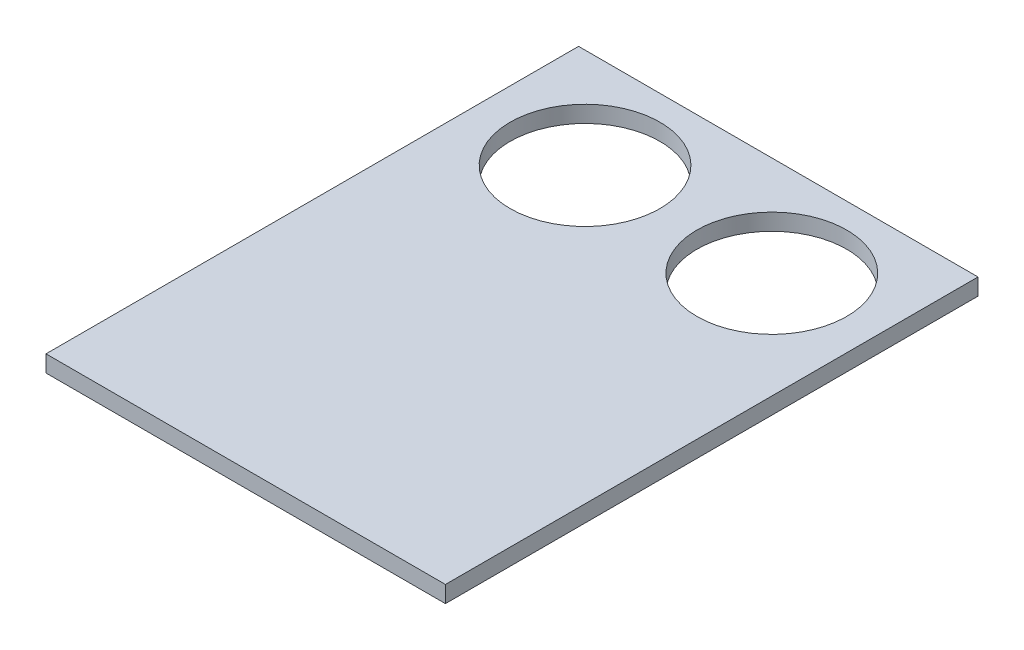
ISO-10303-21;
HEADER;
FILE_DESCRIPTION(('STEP AP214'),'2;1');
FILE_NAME('part.step','',(''),(''),'','','');
FILE_SCHEMA(('AUTOMOTIVE_DESIGN { 1 0 10303 214 1 1 1 1 }'));
ENDSEC;
DATA;
#1=APPLICATION_CONTEXT('core data for automotive mechanical design processes');
#2=APPLICATION_PROTOCOL_DEFINITION('international standard','automotive_design',2000,#1);
#3=PRODUCT_CONTEXT('',#1,'mechanical');
#4=PRODUCT('Part','Part','',(#3));
#5=PRODUCT_RELATED_PRODUCT_CATEGORY('part','',(#4));
#6=PRODUCT_DEFINITION_FORMATION('','',#4);
#7=PRODUCT_DEFINITION_CONTEXT('part definition',#1,'design');
#8=PRODUCT_DEFINITION('design','',#6,#7);
#9=PRODUCT_DEFINITION_SHAPE('','',#8);
#10=(LENGTH_UNIT() NAMED_UNIT(*) SI_UNIT(.MILLI.,.METRE.));
#11=(NAMED_UNIT(*) PLANE_ANGLE_UNIT() SI_UNIT($,.RADIAN.));
#12=(NAMED_UNIT(*) SI_UNIT($,.STERADIAN.) SOLID_ANGLE_UNIT());
#13=UNCERTAINTY_MEASURE_WITH_UNIT(LENGTH_MEASURE(1.E-05),#10,'distance_accuracy_value','');
#14=(GEOMETRIC_REPRESENTATION_CONTEXT(3) GLOBAL_UNCERTAINTY_ASSIGNED_CONTEXT((#13)) GLOBAL_UNIT_ASSIGNED_CONTEXT((#10,
#11,#12)) REPRESENTATION_CONTEXT('',''));
#15=CARTESIAN_POINT('',(0.,0.,0.));
#16=DIRECTION('',(0.,0.,1.));
#17=DIRECTION('',(1.,0.,0.));
#18=AXIS2_PLACEMENT_3D('',#15,#16,#17);
#19=CARTESIAN_POINT('',(0.,3.175,0.));
#20=DIRECTION('',(0.,1.,0.));
#21=DIRECTION('',(0.,0.,1.));
#22=AXIS2_PLACEMENT_3D('',#19,#20,#21);
#23=PLANE('',#22);
#24=CARTESIAN_POINT('',(20.2819,3.175,19.05));
#25=DIRECTION('',(0.,1.,0.));
#26=DIRECTION('',(0.,0.,1.));
#27=AXIS2_PLACEMENT_3D('',#24,#25,#26);
#28=CIRCLE('',#27,14.2875);
#29=CARTESIAN_POINT('',(20.2819,3.175,33.3375));
#30=VERTEX_POINT('',#29);
#31=EDGE_CURVE('E112',#30,#30,#28,.T.);
#32=ORIENTED_EDGE('',*,*,#31,.F.);
#33=EDGE_LOOP('',(#32));
#34=FACE_BOUND('',#33,.T.);
#35=CARTESIAN_POINT('',(55.9181,3.175,19.05));
#36=DIRECTION('',(0.,1.,0.));
#37=DIRECTION('',(0.,0.,1.));
#38=AXIS2_PLACEMENT_3D('',#35,#36,#37);
#39=CIRCLE('',#38,14.2875);
#40=CARTESIAN_POINT('',(55.9181,3.175,33.3375));
#41=VERTEX_POINT('',#40);
#42=EDGE_CURVE('E117',#41,#41,#39,.T.);
#43=ORIENTED_EDGE('',*,*,#42,.F.);
#44=EDGE_LOOP('',(#43));
#45=FACE_BOUND('',#44,.T.);
#46=DIRECTION('',(0.,0.,1.));
#47=VECTOR('',#46,1.);
#48=CARTESIAN_POINT('',(0.,3.175,0.));
#49=LINE('',#48,#47);
#50=CARTESIAN_POINT('',(0.,3.175,0.));
#51=VERTEX_POINT('',#50);
#52=CARTESIAN_POINT('',(0.,3.175,101.6));
#53=VERTEX_POINT('',#52);
#54=EDGE_CURVE('E90',#51,#53,#49,.T.);
#55=ORIENTED_EDGE('',*,*,#54,.T.);
#56=DIRECTION('',(1.,0.,0.));
#57=VECTOR('',#56,1.);
#58=CARTESIAN_POINT('',(0.,3.175,101.6));
#59=LINE('',#58,#57);
#60=CARTESIAN_POINT('',(76.2,3.175,101.6));
#61=VERTEX_POINT('',#60);
#62=EDGE_CURVE('E86',#53,#61,#59,.T.);
#63=ORIENTED_EDGE('',*,*,#62,.T.);
#64=DIRECTION('',(0.,0.,-1.));
#65=VECTOR('',#64,1.);
#66=CARTESIAN_POINT('',(76.2,3.175,0.));
#67=LINE('',#66,#65);
#68=CARTESIAN_POINT('',(76.2,3.175,0.));
#69=VERTEX_POINT('',#68);
#70=EDGE_CURVE('E88',#61,#69,#67,.T.);
#71=ORIENTED_EDGE('',*,*,#70,.T.);
#72=DIRECTION('',(-1.,0.,0.));
#73=VECTOR('',#72,1.);
#74=CARTESIAN_POINT('',(0.,3.175,0.));
#75=LINE('',#74,#73);
#76=EDGE_CURVE('E56',#69,#51,#75,.T.);
#77=ORIENTED_EDGE('',*,*,#76,.T.);
#78=EDGE_LOOP('',(#55,#63,#71,#77));
#79=FACE_BOUND('',#78,.T.);
#80=ADVANCED_FACE('F37',(#34,#45,#79),#23,.T.);
#81=CARTESIAN_POINT('',(0.,0.,0.));
#82=DIRECTION('',(0.,1.,0.));
#83=DIRECTION('',(0.,0.,1.));
#84=AXIS2_PLACEMENT_3D('',#81,#82,#83);
#85=PLANE('',#84);
#86=CARTESIAN_POINT('',(20.2819,0.,19.05));
#87=DIRECTION('',(0.,1.,0.));
#88=DIRECTION('',(0.,0.,1.));
#89=AXIS2_PLACEMENT_3D('',#86,#87,#88);
#90=CIRCLE('',#89,14.2875);
#91=CARTESIAN_POINT('',(20.2819,0.,33.3375));
#92=VERTEX_POINT('',#91);
#93=EDGE_CURVE('E41',#92,#92,#90,.T.);
#94=ORIENTED_EDGE('',*,*,#93,.T.);
#95=EDGE_LOOP('',(#94));
#96=FACE_BOUND('',#95,.T.);
#97=CARTESIAN_POINT('',(55.9181,0.,19.05));
#98=DIRECTION('',(0.,1.,0.));
#99=DIRECTION('',(0.,0.,1.));
#100=AXIS2_PLACEMENT_3D('',#97,#98,#99);
#101=CIRCLE('',#100,14.2875);
#102=CARTESIAN_POINT('',(55.9181,0.,33.3375));
#103=VERTEX_POINT('',#102);
#104=EDGE_CURVE('E110',#103,#103,#101,.T.);
#105=ORIENTED_EDGE('',*,*,#104,.T.);
#106=EDGE_LOOP('',(#105));
#107=FACE_BOUND('',#106,.T.);
#108=DIRECTION('',(0.,0.,1.));
#109=VECTOR('',#108,1.);
#110=CARTESIAN_POINT('',(0.,0.,0.));
#111=LINE('',#110,#109);
#112=CARTESIAN_POINT('',(0.,0.,0.));
#113=VERTEX_POINT('',#112);
#114=CARTESIAN_POINT('',(0.,0.,101.6));
#115=VERTEX_POINT('',#114);
#116=EDGE_CURVE('E103',#113,#115,#111,.T.);
#117=ORIENTED_EDGE('',*,*,#116,.F.);
#118=DIRECTION('',(-1.,0.,0.));
#119=VECTOR('',#118,1.);
#120=CARTESIAN_POINT('',(0.,0.,0.));
#121=LINE('',#120,#119);
#122=CARTESIAN_POINT('',(76.2,0.,0.));
#123=VERTEX_POINT('',#122);
#124=EDGE_CURVE('E79',#123,#113,#121,.T.);
#125=ORIENTED_EDGE('',*,*,#124,.F.);
#126=DIRECTION('',(0.,0.,-1.));
#127=VECTOR('',#126,1.);
#128=CARTESIAN_POINT('',(76.2,0.,0.));
#129=LINE('',#128,#127);
#130=CARTESIAN_POINT('',(76.2,0.,101.6));
#131=VERTEX_POINT('',#130);
#132=EDGE_CURVE('E73',#131,#123,#129,.T.);
#133=ORIENTED_EDGE('',*,*,#132,.F.);
#134=DIRECTION('',(1.,0.,0.));
#135=VECTOR('',#134,1.);
#136=CARTESIAN_POINT('',(0.,0.,101.6));
#137=LINE('',#136,#135);
#138=EDGE_CURVE('E94',#115,#131,#137,.T.);
#139=ORIENTED_EDGE('',*,*,#138,.F.);
#140=EDGE_LOOP('',(#117,#125,#133,#139));
#141=FACE_BOUND('',#140,.T.);
#142=ADVANCED_FACE('F129',(#96,#107,#141),#85,.F.);
#143=CARTESIAN_POINT('',(0.,3.175,0.));
#144=DIRECTION('',(1.,0.,0.));
#145=DIRECTION('',(0.,0.,-1.));
#146=AXIS2_PLACEMENT_3D('',#143,#144,#145);
#147=PLANE('',#146);
#148=ORIENTED_EDGE('',*,*,#116,.T.);
#149=DIRECTION('',(0.,-1.,0.));
#150=VECTOR('',#149,1.);
#151=CARTESIAN_POINT('',(0.,3.175,101.6));
#152=LINE('',#151,#150);
#153=EDGE_CURVE('E11',#53,#115,#152,.T.);
#154=ORIENTED_EDGE('',*,*,#153,.F.);
#155=ORIENTED_EDGE('',*,*,#54,.F.);
#156=DIRECTION('',(0.,-1.,0.));
#157=VECTOR('',#156,1.);
#158=CARTESIAN_POINT('',(0.,3.175,0.));
#159=LINE('',#158,#157);
#160=EDGE_CURVE('E99',#51,#113,#159,.T.);
#161=ORIENTED_EDGE('',*,*,#160,.T.);
#162=EDGE_LOOP('',(#148,#154,#155,#161));
#163=FACE_BOUND('',#162,.T.);
#164=ADVANCED_FACE('F39',(#163),#147,.F.);
#165=CARTESIAN_POINT('',(0.,3.175,101.6));
#166=DIRECTION('',(0.,0.,-1.));
#167=DIRECTION('',(-1.,0.,0.));
#168=AXIS2_PLACEMENT_3D('',#165,#166,#167);
#169=PLANE('',#168);
#170=ORIENTED_EDGE('',*,*,#138,.T.);
#171=DIRECTION('',(0.,-1.,0.));
#172=VECTOR('',#171,1.);
#173=CARTESIAN_POINT('',(76.2,3.175,101.6));
#174=LINE('',#173,#172);
#175=EDGE_CURVE('E47',#61,#131,#174,.T.);
#176=ORIENTED_EDGE('',*,*,#175,.F.);
#177=ORIENTED_EDGE('',*,*,#62,.F.);
#178=ORIENTED_EDGE('',*,*,#153,.T.);
#179=EDGE_LOOP('',(#170,#176,#177,#178));
#180=FACE_BOUND('',#179,.T.);
#181=ADVANCED_FACE('F93',(#180),#169,.F.);
#182=CARTESIAN_POINT('',(76.2,3.175,0.));
#183=DIRECTION('',(-1.,0.,0.));
#184=DIRECTION('',(0.,0.,1.));
#185=AXIS2_PLACEMENT_3D('',#182,#183,#184);
#186=PLANE('',#185);
#187=ORIENTED_EDGE('',*,*,#132,.T.);
#188=DIRECTION('',(0.,-1.,0.));
#189=VECTOR('',#188,1.);
#190=CARTESIAN_POINT('',(76.2,3.175,0.));
#191=LINE('',#190,#189);
#192=EDGE_CURVE('E95',#69,#123,#191,.T.);
#193=ORIENTED_EDGE('',*,*,#192,.F.);
#194=ORIENTED_EDGE('',*,*,#70,.F.);
#195=ORIENTED_EDGE('',*,*,#175,.T.);
#196=EDGE_LOOP('',(#187,#193,#194,#195));
#197=FACE_BOUND('',#196,.T.);
#198=ADVANCED_FACE('F97',(#197),#186,.F.);
#199=CARTESIAN_POINT('',(0.,3.175,0.));
#200=DIRECTION('',(0.,0.,1.));
#201=DIRECTION('',(1.,0.,0.));
#202=AXIS2_PLACEMENT_3D('',#199,#200,#201);
#203=PLANE('',#202);
#204=ORIENTED_EDGE('',*,*,#124,.T.);
#205=ORIENTED_EDGE('',*,*,#160,.F.);
#206=ORIENTED_EDGE('',*,*,#76,.F.);
#207=ORIENTED_EDGE('',*,*,#192,.T.);
#208=EDGE_LOOP('',(#204,#205,#206,#207));
#209=FACE_BOUND('',#208,.T.);
#210=ADVANCED_FACE('F140',(#209),#203,.F.);
#211=CARTESIAN_POINT('',(55.9181,-25.4,19.05));
#212=DIRECTION('',(0.,1.,0.));
#213=DIRECTION('',(0.,0.,1.));
#214=AXIS2_PLACEMENT_3D('',#211,#212,#213);
#215=CYLINDRICAL_SURFACE('',#214,14.2875);
#216=ORIENTED_EDGE('',*,*,#42,.T.);
#217=EDGE_LOOP('',(#216));
#218=FACE_BOUND('',#217,.T.);
#219=ORIENTED_EDGE('',*,*,#104,.F.);
#220=EDGE_LOOP('',(#219));
#221=FACE_BOUND('',#220,.T.);
#222=ADVANCED_FACE('F125',(#218,#221),#215,.F.);
#223=CARTESIAN_POINT('',(20.2819,-25.4,19.05));
#224=DIRECTION('',(0.,1.,0.));
#225=DIRECTION('',(0.,0.,1.));
#226=AXIS2_PLACEMENT_3D('',#223,#224,#225);
#227=CYLINDRICAL_SURFACE('',#226,14.2875);
#228=ORIENTED_EDGE('',*,*,#31,.T.);
#229=EDGE_LOOP('',(#228));
#230=FACE_BOUND('',#229,.T.);
#231=ORIENTED_EDGE('',*,*,#93,.F.);
#232=EDGE_LOOP('',(#231));
#233=FACE_BOUND('',#232,.T.);
#234=ADVANCED_FACE('F169',(#230,#233),#227,.F.);
#235=CLOSED_SHELL('',(#80,#142,#164,#181,#198,#210,#222,#234));
#236=MANIFOLD_SOLID_BREP('B2',#235);
#237=ADVANCED_BREP_SHAPE_REPRESENTATION('',(#18,#236),#14);
#238=SHAPE_DEFINITION_REPRESENTATION(#9,#237);
ENDSEC;
END-ISO-10303-21;
